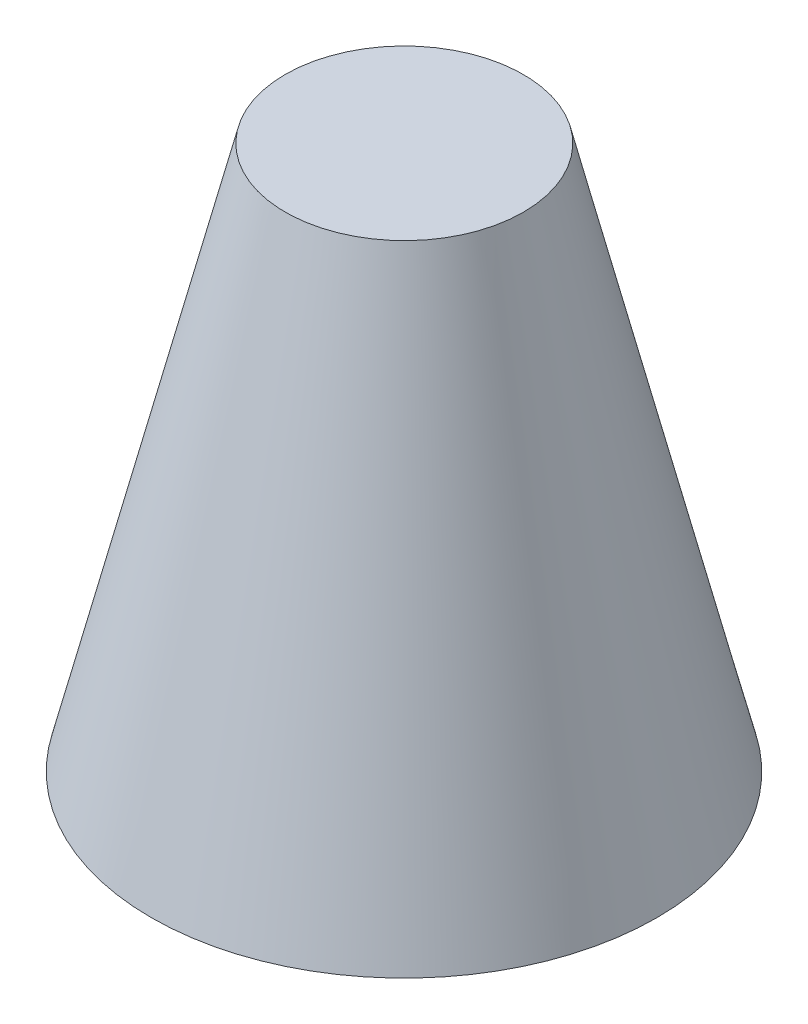
ISO-10303-21;
HEADER;
FILE_DESCRIPTION(('STEP AP214'),'2;1');
FILE_NAME('part.step','',(''),(''),'','','');
FILE_SCHEMA(('AUTOMOTIVE_DESIGN { 1 0 10303 214 1 1 1 1 }'));
ENDSEC;
DATA;
#1=APPLICATION_CONTEXT('core data for automotive mechanical design processes');
#2=APPLICATION_PROTOCOL_DEFINITION('international standard','automotive_design',2000,#1);
#3=PRODUCT_CONTEXT('',#1,'mechanical');
#4=PRODUCT('Part','Part','',(#3));
#5=PRODUCT_RELATED_PRODUCT_CATEGORY('part','',(#4));
#6=PRODUCT_DEFINITION_FORMATION('','',#4);
#7=PRODUCT_DEFINITION_CONTEXT('part definition',#1,'design');
#8=PRODUCT_DEFINITION('design','',#6,#7);
#9=PRODUCT_DEFINITION_SHAPE('','',#8);
#10=(LENGTH_UNIT() NAMED_UNIT(*) SI_UNIT(.MILLI.,.METRE.));
#11=(NAMED_UNIT(*) PLANE_ANGLE_UNIT() SI_UNIT($,.RADIAN.));
#12=(NAMED_UNIT(*) SI_UNIT($,.STERADIAN.) SOLID_ANGLE_UNIT());
#13=UNCERTAINTY_MEASURE_WITH_UNIT(LENGTH_MEASURE(1.E-05),#10,'distance_accuracy_value','');
#14=(GEOMETRIC_REPRESENTATION_CONTEXT(3) GLOBAL_UNCERTAINTY_ASSIGNED_CONTEXT((#13)) GLOBAL_UNIT_ASSIGNED_CONTEXT((#10,
#11,#12)) REPRESENTATION_CONTEXT('',''));
#15=CARTESIAN_POINT('',(0.,0.,0.));
#16=DIRECTION('',(0.,0.,1.));
#17=DIRECTION('',(1.,0.,0.));
#18=AXIS2_PLACEMENT_3D('',#15,#16,#17);
#19=CARTESIAN_POINT('',(317.996041741777,37.8060802176783,0.));
#20=DIRECTION('',(-0.000564798591427497,-0.999999840501263,0.));
#21=DIRECTION('',(0.999999840501263,-0.000564798591427497,0.));
#22=AXIS2_PLACEMENT_3D('',#19,#20,#21);
#23=CONICAL_SURFACE('',#22,6.94208613323562,0.241152297466734);
#24=CARTESIAN_POINT('',(317.977536709872,5.04213704459085,0.));
#25=DIRECTION('',(0.000564798591427497,0.999999840501263,0.));
#26=DIRECTION('',(-0.999999840501263,0.000564798591427497,0.));
#27=AXIS2_PLACEMENT_3D('',#24,#25,#26);
#28=CIRCLE('',#27,14.9999976075191);
#29=CARTESIAN_POINT('',(302.977541494833,5.050609022111,0.));
#30=VERTEX_POINT('',#29);
#31=EDGE_CURVE('E67',#30,#30,#28,.T.);
#32=ORIENTED_EDGE('',*,*,#31,.T.);
#33=EDGE_LOOP('',(#32));
#34=FACE_BOUND('',#33,.T.);
#35=CARTESIAN_POINT('',(317.995759342481,37.3060802974276,0.));
#36=DIRECTION('',(0.000564798591426951,0.999999840501263,0.));
#37=DIRECTION('',(-0.999999840501263,0.000564798591426951,0.));
#38=AXIS2_PLACEMENT_3D('',#35,#36,#37);
#39=CIRCLE('',#38,7.06505530923632);
#40=CARTESIAN_POINT('',(310.930705160112,37.3100706307147,0.));
#41=VERTEX_POINT('',#40);
#42=EDGE_CURVE('E49',#41,#41,#39,.F.);
#43=ORIENTED_EDGE('',*,*,#42,.T.);
#44=EDGE_LOOP('',(#43));
#45=FACE_BOUND('',#44,.T.);
#46=ADVANCED_FACE('F45',(#34,#45),#23,.T.);
#47=CARTESIAN_POINT('',(317.977536709872,5.04213704459085,0.));
#48=DIRECTION('',(-0.000564798591427497,-0.999999840501263,0.));
#49=DIRECTION('',(0.999999840501263,-0.000564798591427497,0.));
#50=AXIS2_PLACEMENT_3D('',#47,#48,#49);
#51=CONICAL_SURFACE('',#50,14.999997607519,1.57023152817344);
#52=CARTESIAN_POINT('',(317.977537207943,5.04301890154435,0.));
#53=DIRECTION('',(0.000564798591427497,0.999999840501263,0.));
#54=DIRECTION('',(-0.999999840501263,0.000564798591427497,0.));
#55=AXIS2_PLACEMENT_3D('',#52,#53,#54);
#56=CIRCLE('',#55,13.4386322519985);
#57=CARTESIAN_POINT('',(304.53890709939,5.05060902211099,0.));
#58=VERTEX_POINT('',#57);
#59=EDGE_CURVE('E11',#58,#58,#56,.T.);
#60=ORIENTED_EDGE('',*,*,#59,.T.);
#61=EDGE_LOOP('',(#60));
#62=FACE_BOUND('',#61,.T.);
#63=ORIENTED_EDGE('',*,*,#31,.F.);
#64=EDGE_LOOP('',(#63));
#65=FACE_BOUND('',#64,.T.);
#66=ADVANCED_FACE('F47',(#62,#65),#51,.F.);
#67=CARTESIAN_POINT('',(317.977537207943,5.04301890154435,0.));
#68=DIRECTION('',(-0.000564798591427497,-0.999999840501263,0.));
#69=DIRECTION('',(0.999999840501263,-0.000564798591427497,0.));
#70=AXIS2_PLACEMENT_3D('',#67,#68,#69);
#71=CONICAL_SURFACE('',#70,13.4386322519985,0.241152297466736);
#72=CARTESIAN_POINT('',(317.987738001927,23.1039569266605,0.));
#73=DIRECTION('',(0.000564798591427497,0.999999840501263,0.));
#74=DIRECTION('',(-0.999999840501263,0.000564798591427497,0.));
#75=AXIS2_PLACEMENT_3D('',#72,#73,#74);
#76=CIRCLE('',#75,8.99675421002799);
#77=CARTESIAN_POINT('',(308.99098522687,23.1090382807657,0.));
#78=VERTEX_POINT('',#77);
#79=EDGE_CURVE('E54',#78,#78,#76,.T.);
#80=ORIENTED_EDGE('',*,*,#79,.T.);
#81=EDGE_LOOP('',(#80));
#82=FACE_BOUND('',#81,.T.);
#83=ORIENTED_EDGE('',*,*,#59,.F.);
#84=EDGE_LOOP('',(#83));
#85=FACE_BOUND('',#84,.T.);
#86=ADVANCED_FACE('F61',(#82,#85),#71,.F.);
#87=CARTESIAN_POINT('',(317.987738001927,23.1039569266605,0.));
#88=DIRECTION('',(-0.000564798591427497,-0.999999840501263,0.));
#89=DIRECTION('',(0.999999840501263,-0.000564798591427497,0.));
#90=AXIS2_PLACEMENT_3D('',#87,#88,#89);
#91=CONICAL_SURFACE('',#90,8.99675421002801,1.57023152817344);
#92=CARTESIAN_POINT('',(317.987740871869,23.1090382807657,0.));
#93=VERTEX_POINT('',#92);
#94=VERTEX_LOOP('',#93);
#95=FACE_BOUND('',#94,.T.);
#96=ORIENTED_EDGE('',*,*,#79,.F.);
#97=EDGE_LOOP('',(#96));
#98=FACE_BOUND('',#97,.T.);
#99=ADVANCED_FACE('F57',(#95,#98),#91,.F.);
#100=CARTESIAN_POINT('',(317.995759342481,37.3060802974276,0.));
#101=DIRECTION('',(0.000564798591426951,0.999999840501263,0.));
#102=DIRECTION('',(-0.999999840501263,0.000564798591426951,0.));
#103=AXIS2_PLACEMENT_3D('',#100,#101,#102);
#104=PLANE('',#103);
#105=ORIENTED_EDGE('',*,*,#42,.F.);
#106=EDGE_LOOP('',(#105));
#107=FACE_BOUND('',#106,.T.);
#108=ADVANCED_FACE('F60',(#107),#104,.T.);
#109=CLOSED_SHELL('',(#46,#66,#86,#99,#108));
#110=MANIFOLD_SOLID_BREP('B2',#109);
#111=ADVANCED_BREP_SHAPE_REPRESENTATION('',(#18,#110),#14);
#112=SHAPE_DEFINITION_REPRESENTATION(#9,#111);
ENDSEC;
END-ISO-10303-21;
